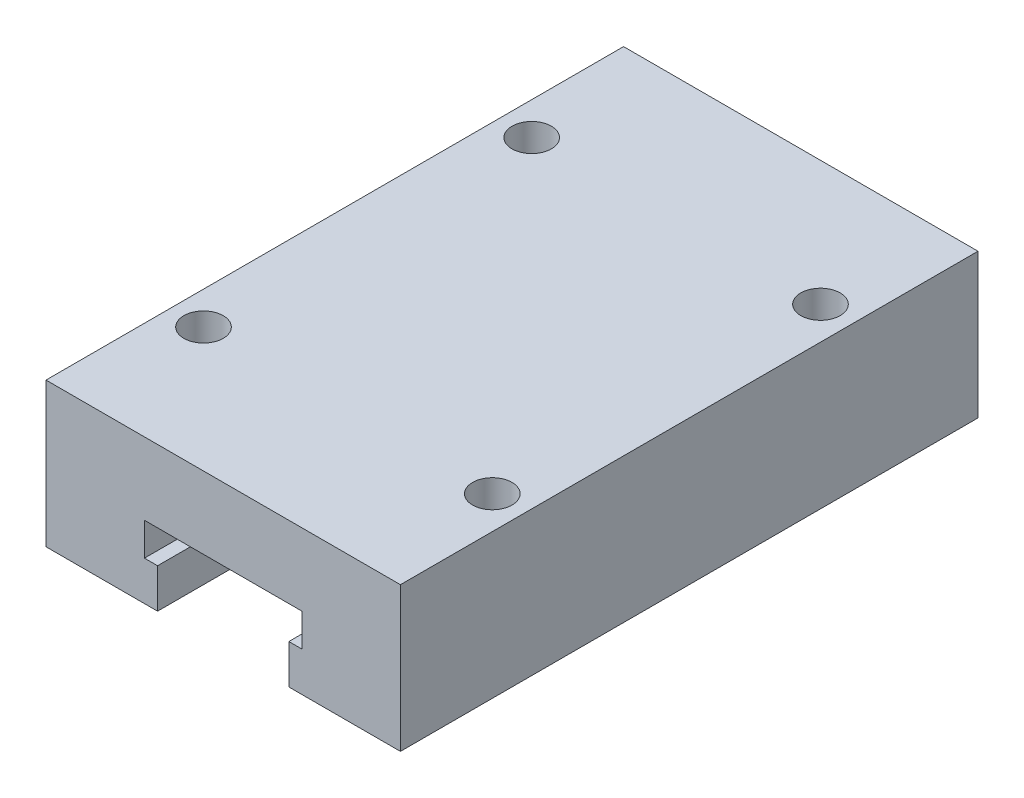
ISO-10303-21;
HEADER;
FILE_DESCRIPTION(('STEP AP214'),'2;1');
FILE_NAME('part.step','',(''),(''),'','','');
FILE_SCHEMA(('AUTOMOTIVE_DESIGN { 1 0 10303 214 1 1 1 1 }'));
ENDSEC;
DATA;
#1=APPLICATION_CONTEXT('core data for automotive mechanical design processes');
#2=APPLICATION_PROTOCOL_DEFINITION('international standard','automotive_design',2000,#1);
#3=PRODUCT_CONTEXT('',#1,'mechanical');
#4=PRODUCT('Part','Part','',(#3));
#5=PRODUCT_RELATED_PRODUCT_CATEGORY('part','',(#4));
#6=PRODUCT_DEFINITION_FORMATION('','',#4);
#7=PRODUCT_DEFINITION_CONTEXT('part definition',#1,'design');
#8=PRODUCT_DEFINITION('design','',#6,#7);
#9=PRODUCT_DEFINITION_SHAPE('','',#8);
#10=(LENGTH_UNIT() NAMED_UNIT(*) SI_UNIT(.MILLI.,.METRE.));
#11=(NAMED_UNIT(*) PLANE_ANGLE_UNIT() SI_UNIT($,.RADIAN.));
#12=(NAMED_UNIT(*) SI_UNIT($,.STERADIAN.) SOLID_ANGLE_UNIT());
#13=UNCERTAINTY_MEASURE_WITH_UNIT(LENGTH_MEASURE(1.E-05),#10,'distance_accuracy_value','');
#14=(GEOMETRIC_REPRESENTATION_CONTEXT(3) GLOBAL_UNCERTAINTY_ASSIGNED_CONTEXT((#13)) GLOBAL_UNIT_ASSIGNED_CONTEXT((#10,
#11,#12)) REPRESENTATION_CONTEXT('',''));
#15=CARTESIAN_POINT('',(0.,0.,0.));
#16=DIRECTION('',(0.,0.,1.));
#17=DIRECTION('',(1.,0.,0.));
#18=AXIS2_PLACEMENT_3D('',#15,#16,#17);
#19=CARTESIAN_POINT('',(7.5,5.5,44.));
#20=DIRECTION('',(0.,1.,0.));
#21=DIRECTION('',(0.,0.,1.));
#22=AXIS2_PLACEMENT_3D('',#19,#20,#21);
#23=PLANE('',#22);
#24=DIRECTION('',(1.,0.,0.));
#25=VECTOR('',#24,1.);
#26=CARTESIAN_POINT('',(7.5,5.5,0.));
#27=LINE('',#26,#25);
#28=CARTESIAN_POINT('',(7.5,5.5,0.));
#29=VERTEX_POINT('',#28);
#30=CARTESIAN_POINT('',(19.5,5.5,0.));
#31=VERTEX_POINT('',#30);
#32=EDGE_CURVE('E164',#29,#31,#27,.T.);
#33=ORIENTED_EDGE('',*,*,#32,.T.);
#34=DIRECTION('',(0.,0.,-1.));
#35=VECTOR('',#34,1.);
#36=CARTESIAN_POINT('',(19.5,5.5,44.));
#37=LINE('',#36,#35);
#38=CARTESIAN_POINT('',(19.5,5.5,44.));
#39=VERTEX_POINT('',#38);
#40=EDGE_CURVE('E11',#39,#31,#37,.T.);
#41=ORIENTED_EDGE('',*,*,#40,.F.);
#42=DIRECTION('',(1.,0.,0.));
#43=VECTOR('',#42,1.);
#44=CARTESIAN_POINT('',(7.5,5.5,44.));
#45=LINE('',#44,#43);
#46=CARTESIAN_POINT('',(7.5,5.5,44.));
#47=VERTEX_POINT('',#46);
#48=EDGE_CURVE('E199',#47,#39,#45,.T.);
#49=ORIENTED_EDGE('',*,*,#48,.F.);
#50=DIRECTION('',(0.,0.,-1.));
#51=VECTOR('',#50,1.);
#52=CARTESIAN_POINT('',(7.5,5.5,44.));
#53=LINE('',#52,#51);
#54=EDGE_CURVE('E160',#47,#29,#53,.T.);
#55=ORIENTED_EDGE('',*,*,#54,.T.);
#56=EDGE_LOOP('',(#33,#41,#49,#55));
#57=FACE_BOUND('',#56,.T.);
#58=ADVANCED_FACE('F39',(#57),#23,.F.);
#59=CARTESIAN_POINT('',(19.5,5.5,44.));
#60=DIRECTION('',(1.,0.,0.));
#61=DIRECTION('',(0.,0.,-1.));
#62=AXIS2_PLACEMENT_3D('',#59,#60,#61);
#63=PLANE('',#62);
#64=DIRECTION('',(0.,-1.,0.));
#65=VECTOR('',#64,1.);
#66=CARTESIAN_POINT('',(19.5,5.5,0.));
#67=LINE('',#66,#65);
#68=CARTESIAN_POINT('',(19.5,3.,0.));
#69=VERTEX_POINT('',#68);
#70=EDGE_CURVE('E168',#31,#69,#67,.T.);
#71=ORIENTED_EDGE('',*,*,#70,.T.);
#72=DIRECTION('',(0.,0.,-1.));
#73=VECTOR('',#72,1.);
#74=CARTESIAN_POINT('',(19.5,3.,44.));
#75=LINE('',#74,#73);
#76=CARTESIAN_POINT('',(19.5,3.,44.));
#77=VERTEX_POINT('',#76);
#78=EDGE_CURVE('E48',#77,#69,#75,.T.);
#79=ORIENTED_EDGE('',*,*,#78,.F.);
#80=DIRECTION('',(0.,-1.,0.));
#81=VECTOR('',#80,1.);
#82=CARTESIAN_POINT('',(19.5,5.5,44.));
#83=LINE('',#82,#81);
#84=EDGE_CURVE('E111',#39,#77,#83,.T.);
#85=ORIENTED_EDGE('',*,*,#84,.F.);
#86=ORIENTED_EDGE('',*,*,#40,.T.);
#87=EDGE_LOOP('',(#71,#79,#85,#86));
#88=FACE_BOUND('',#87,.T.);
#89=ADVANCED_FACE('F293',(#88),#63,.F.);
#90=CARTESIAN_POINT('',(19.5,3.,44.));
#91=DIRECTION('',(0.,-1.,0.));
#92=DIRECTION('',(0.,0.,-1.));
#93=AXIS2_PLACEMENT_3D('',#90,#91,#92);
#94=PLANE('',#93);
#95=DIRECTION('',(-1.,0.,0.));
#96=VECTOR('',#95,1.);
#97=CARTESIAN_POINT('',(19.5,3.,0.));
#98=LINE('',#97,#96);
#99=CARTESIAN_POINT('',(18.5,3.,0.));
#100=VERTEX_POINT('',#99);
#101=EDGE_CURVE('E172',#69,#100,#98,.T.);
#102=ORIENTED_EDGE('',*,*,#101,.T.);
#103=DIRECTION('',(0.,0.,-1.));
#104=VECTOR('',#103,1.);
#105=CARTESIAN_POINT('',(18.5,3.,44.));
#106=LINE('',#105,#104);
#107=CARTESIAN_POINT('',(18.5,3.,44.));
#108=VERTEX_POINT('',#107);
#109=EDGE_CURVE('E226',#108,#100,#106,.T.);
#110=ORIENTED_EDGE('',*,*,#109,.F.);
#111=DIRECTION('',(-1.,0.,0.));
#112=VECTOR('',#111,1.);
#113=CARTESIAN_POINT('',(19.5,3.,44.));
#114=LINE('',#113,#112);
#115=EDGE_CURVE('E236',#77,#108,#114,.T.);
#116=ORIENTED_EDGE('',*,*,#115,.F.);
#117=ORIENTED_EDGE('',*,*,#78,.T.);
#118=EDGE_LOOP('',(#102,#110,#116,#117));
#119=FACE_BOUND('',#118,.T.);
#120=ADVANCED_FACE('F234',(#119),#94,.F.);
#121=CARTESIAN_POINT('',(18.5,3.,44.));
#122=DIRECTION('',(1.,0.,0.));
#123=DIRECTION('',(0.,0.,-1.));
#124=AXIS2_PLACEMENT_3D('',#121,#122,#123);
#125=PLANE('',#124);
#126=DIRECTION('',(0.,-1.,0.));
#127=VECTOR('',#126,1.);
#128=CARTESIAN_POINT('',(18.5,3.,0.));
#129=LINE('',#128,#127);
#130=CARTESIAN_POINT('',(18.5,0.,0.));
#131=VERTEX_POINT('',#130);
#132=EDGE_CURVE('E175',#100,#131,#129,.T.);
#133=ORIENTED_EDGE('',*,*,#132,.T.);
#134=DIRECTION('',(0.,0.,-1.));
#135=VECTOR('',#134,1.);
#136=CARTESIAN_POINT('',(18.5,0.,44.));
#137=LINE('',#136,#135);
#138=CARTESIAN_POINT('',(18.5,0.,44.));
#139=VERTEX_POINT('',#138);
#140=EDGE_CURVE('E222',#139,#131,#137,.T.);
#141=ORIENTED_EDGE('',*,*,#140,.F.);
#142=DIRECTION('',(0.,-1.,0.));
#143=VECTOR('',#142,1.);
#144=CARTESIAN_POINT('',(18.5,3.,44.));
#145=LINE('',#144,#143);
#146=EDGE_CURVE('E255',#108,#139,#145,.T.);
#147=ORIENTED_EDGE('',*,*,#146,.F.);
#148=ORIENTED_EDGE('',*,*,#109,.T.);
#149=EDGE_LOOP('',(#133,#141,#147,#148));
#150=FACE_BOUND('',#149,.T.);
#151=ADVANCED_FACE('F245',(#150),#125,.F.);
#152=CARTESIAN_POINT('',(27.,0.,44.));
#153=DIRECTION('',(0.,1.,0.));
#154=DIRECTION('',(-1.,0.,0.));
#155=AXIS2_PLACEMENT_3D('',#152,#153,#154);
#156=PLANE('',#155);
#157=DIRECTION('',(1.,0.,0.));
#158=VECTOR('',#157,1.);
#159=CARTESIAN_POINT('',(27.,0.,0.));
#160=LINE('',#159,#158);
#161=CARTESIAN_POINT('',(27.,0.,0.));
#162=VERTEX_POINT('',#161);
#163=EDGE_CURVE('E178',#131,#162,#160,.T.);
#164=ORIENTED_EDGE('',*,*,#163,.T.);
#165=DIRECTION('',(0.,0.,-1.));
#166=VECTOR('',#165,1.);
#167=CARTESIAN_POINT('',(27.,0.,44.));
#168=LINE('',#167,#166);
#169=CARTESIAN_POINT('',(27.,0.,44.));
#170=VERTEX_POINT('',#169);
#171=EDGE_CURVE('E218',#170,#162,#168,.T.);
#172=ORIENTED_EDGE('',*,*,#171,.F.);
#173=DIRECTION('',(1.,0.,0.));
#174=VECTOR('',#173,1.);
#175=CARTESIAN_POINT('',(27.,0.,44.));
#176=LINE('',#175,#174);
#177=EDGE_CURVE('E251',#139,#170,#176,.T.);
#178=ORIENTED_EDGE('',*,*,#177,.F.);
#179=ORIENTED_EDGE('',*,*,#140,.T.);
#180=EDGE_LOOP('',(#164,#172,#178,#179));
#181=FACE_BOUND('',#180,.T.);
#182=ADVANCED_FACE('F249',(#181),#156,.F.);
#183=CARTESIAN_POINT('',(27.,11.,44.));
#184=DIRECTION('',(-1.,0.,0.));
#185=DIRECTION('',(0.,0.,1.));
#186=AXIS2_PLACEMENT_3D('',#183,#184,#185);
#187=PLANE('',#186);
#188=DIRECTION('',(0.,1.,0.));
#189=VECTOR('',#188,1.);
#190=CARTESIAN_POINT('',(27.,11.,0.));
#191=LINE('',#190,#189);
#192=CARTESIAN_POINT('',(27.,11.,0.));
#193=VERTEX_POINT('',#192);
#194=EDGE_CURVE('E181',#162,#193,#191,.T.);
#195=ORIENTED_EDGE('',*,*,#194,.T.);
#196=DIRECTION('',(0.,0.,-1.));
#197=VECTOR('',#196,1.);
#198=CARTESIAN_POINT('',(27.,11.,44.));
#199=LINE('',#198,#197);
#200=CARTESIAN_POINT('',(27.,11.,44.));
#201=VERTEX_POINT('',#200);
#202=EDGE_CURVE('E214',#201,#193,#199,.T.);
#203=ORIENTED_EDGE('',*,*,#202,.F.);
#204=DIRECTION('',(0.,1.,0.));
#205=VECTOR('',#204,1.);
#206=CARTESIAN_POINT('',(27.,11.,44.));
#207=LINE('',#206,#205);
#208=EDGE_CURVE('E254',#170,#201,#207,.T.);
#209=ORIENTED_EDGE('',*,*,#208,.F.);
#210=ORIENTED_EDGE('',*,*,#171,.T.);
#211=EDGE_LOOP('',(#195,#203,#209,#210));
#212=FACE_BOUND('',#211,.T.);
#213=ADVANCED_FACE('F306',(#212),#187,.F.);
#214=CARTESIAN_POINT('',(0.,11.,44.));
#215=DIRECTION('',(0.,-1.,0.));
#216=DIRECTION('',(1.,0.,0.));
#217=AXIS2_PLACEMENT_3D('',#214,#215,#216);
#218=PLANE('',#217);
#219=CARTESIAN_POINT('',(2.5,11.,34.5));
#220=DIRECTION('',(0.,1.,0.));
#221=DIRECTION('',(-1.,0.,0.));
#222=AXIS2_PLACEMENT_3D('',#219,#220,#221);
#223=CIRCLE('',#222,1.5);
#224=CARTESIAN_POINT('',(1.,11.,34.5));
#225=VERTEX_POINT('',#224);
#226=EDGE_CURVE('E441',#225,#225,#223,.T.);
#227=ORIENTED_EDGE('',*,*,#226,.F.);
#228=EDGE_LOOP('',(#227));
#229=FACE_BOUND('',#228,.T.);
#230=CARTESIAN_POINT('',(24.5,11.,34.5));
#231=DIRECTION('',(0.,1.,0.));
#232=DIRECTION('',(-1.,0.,0.));
#233=AXIS2_PLACEMENT_3D('',#230,#231,#232);
#234=CIRCLE('',#233,1.5);
#235=CARTESIAN_POINT('',(23.,11.,34.5));
#236=VERTEX_POINT('',#235);
#237=EDGE_CURVE('E440',#236,#236,#234,.T.);
#238=ORIENTED_EDGE('',*,*,#237,.F.);
#239=EDGE_LOOP('',(#238));
#240=FACE_BOUND('',#239,.T.);
#241=CARTESIAN_POINT('',(24.5,11.,9.5));
#242=DIRECTION('',(0.,1.,0.));
#243=DIRECTION('',(-1.,0.,0.));
#244=AXIS2_PLACEMENT_3D('',#241,#242,#243);
#245=CIRCLE('',#244,1.5);
#246=CARTESIAN_POINT('',(23.,11.,9.5));
#247=VERTEX_POINT('',#246);
#248=EDGE_CURVE('E467',#247,#247,#245,.T.);
#249=ORIENTED_EDGE('',*,*,#248,.F.);
#250=EDGE_LOOP('',(#249));
#251=FACE_BOUND('',#250,.T.);
#252=CARTESIAN_POINT('',(2.5,11.,9.49999999999999));
#253=DIRECTION('',(0.,1.,0.));
#254=DIRECTION('',(-1.,0.,0.));
#255=AXIS2_PLACEMENT_3D('',#252,#253,#254);
#256=CIRCLE('',#255,1.5);
#257=CARTESIAN_POINT('',(1.,11.,9.49999999999999));
#258=VERTEX_POINT('',#257);
#259=EDGE_CURVE('E455',#258,#258,#256,.T.);
#260=ORIENTED_EDGE('',*,*,#259,.F.);
#261=EDGE_LOOP('',(#260));
#262=FACE_BOUND('',#261,.T.);
#263=DIRECTION('',(-1.,0.,0.));
#264=VECTOR('',#263,1.);
#265=CARTESIAN_POINT('',(0.,11.,0.));
#266=LINE('',#265,#264);
#267=CARTESIAN_POINT('',(0.,11.,0.));
#268=VERTEX_POINT('',#267);
#269=EDGE_CURVE('E184',#193,#268,#266,.T.);
#270=ORIENTED_EDGE('',*,*,#269,.T.);
#271=DIRECTION('',(0.,0.,-1.));
#272=VECTOR('',#271,1.);
#273=CARTESIAN_POINT('',(0.,11.,44.));
#274=LINE('',#273,#272);
#275=CARTESIAN_POINT('',(0.,11.,44.));
#276=VERTEX_POINT('',#275);
#277=EDGE_CURVE('E210',#276,#268,#274,.T.);
#278=ORIENTED_EDGE('',*,*,#277,.F.);
#279=DIRECTION('',(-1.,0.,0.));
#280=VECTOR('',#279,1.);
#281=CARTESIAN_POINT('',(0.,11.,44.));
#282=LINE('',#281,#280);
#283=EDGE_CURVE('E259',#201,#276,#282,.T.);
#284=ORIENTED_EDGE('',*,*,#283,.F.);
#285=ORIENTED_EDGE('',*,*,#202,.T.);
#286=EDGE_LOOP('',(#270,#278,#284,#285));
#287=FACE_BOUND('',#286,.T.);
#288=ADVANCED_FACE('F309',(#229,#240,#251,#262,#287),#218,.F.);
#289=CARTESIAN_POINT('',(0.,0.,44.));
#290=DIRECTION('',(1.,0.,0.));
#291=DIRECTION('',(0.,1.,0.));
#292=AXIS2_PLACEMENT_3D('',#289,#290,#291);
#293=PLANE('',#292);
#294=DIRECTION('',(0.,-1.,0.));
#295=VECTOR('',#294,1.);
#296=CARTESIAN_POINT('',(0.,0.,0.));
#297=LINE('',#296,#295);
#298=CARTESIAN_POINT('',(0.,0.,0.));
#299=VERTEX_POINT('',#298);
#300=EDGE_CURVE('E187',#268,#299,#297,.T.);
#301=ORIENTED_EDGE('',*,*,#300,.T.);
#302=DIRECTION('',(0.,0.,-1.));
#303=VECTOR('',#302,1.);
#304=CARTESIAN_POINT('',(0.,0.,44.));
#305=LINE('',#304,#303);
#306=CARTESIAN_POINT('',(0.,0.,44.));
#307=VERTEX_POINT('',#306);
#308=EDGE_CURVE('E206',#307,#299,#305,.T.);
#309=ORIENTED_EDGE('',*,*,#308,.F.);
#310=DIRECTION('',(0.,-1.,0.));
#311=VECTOR('',#310,1.);
#312=CARTESIAN_POINT('',(0.,0.,44.));
#313=LINE('',#312,#311);
#314=EDGE_CURVE('E266',#276,#307,#313,.T.);
#315=ORIENTED_EDGE('',*,*,#314,.F.);
#316=ORIENTED_EDGE('',*,*,#277,.T.);
#317=EDGE_LOOP('',(#301,#309,#315,#316));
#318=FACE_BOUND('',#317,.T.);
#319=ADVANCED_FACE('F274',(#318),#293,.F.);
#320=CARTESIAN_POINT('',(0.,0.,44.));
#321=DIRECTION('',(0.,1.,0.));
#322=DIRECTION('',(0.,0.,1.));
#323=AXIS2_PLACEMENT_3D('',#320,#321,#322);
#324=PLANE('',#323);
#325=DIRECTION('',(1.,0.,0.));
#326=VECTOR('',#325,1.);
#327=CARTESIAN_POINT('',(0.,0.,0.));
#328=LINE('',#327,#326);
#329=CARTESIAN_POINT('',(8.5,0.,0.));
#330=VERTEX_POINT('',#329);
#331=EDGE_CURVE('E190',#299,#330,#328,.T.);
#332=ORIENTED_EDGE('',*,*,#331,.T.);
#333=DIRECTION('',(0.,0.,-1.));
#334=VECTOR('',#333,1.);
#335=CARTESIAN_POINT('',(8.5,0.,44.));
#336=LINE('',#335,#334);
#337=CARTESIAN_POINT('',(8.5,0.,44.));
#338=VERTEX_POINT('',#337);
#339=EDGE_CURVE('E153',#338,#330,#336,.T.);
#340=ORIENTED_EDGE('',*,*,#339,.F.);
#341=DIRECTION('',(1.,0.,0.));
#342=VECTOR('',#341,1.);
#343=CARTESIAN_POINT('',(0.,0.,44.));
#344=LINE('',#343,#342);
#345=EDGE_CURVE('E142',#307,#338,#344,.T.);
#346=ORIENTED_EDGE('',*,*,#345,.F.);
#347=ORIENTED_EDGE('',*,*,#308,.T.);
#348=EDGE_LOOP('',(#332,#340,#346,#347));
#349=FACE_BOUND('',#348,.T.);
#350=ADVANCED_FACE('F278',(#349),#324,.F.);
#351=CARTESIAN_POINT('',(8.5,3.,44.));
#352=DIRECTION('',(-1.,0.,0.));
#353=DIRECTION('',(0.,0.,1.));
#354=AXIS2_PLACEMENT_3D('',#351,#352,#353);
#355=PLANE('',#354);
#356=DIRECTION('',(0.,1.,0.));
#357=VECTOR('',#356,1.);
#358=CARTESIAN_POINT('',(8.5,3.,0.));
#359=LINE('',#358,#357);
#360=CARTESIAN_POINT('',(8.5,3.,0.));
#361=VERTEX_POINT('',#360);
#362=EDGE_CURVE('E151',#330,#361,#359,.T.);
#363=ORIENTED_EDGE('',*,*,#362,.T.);
#364=DIRECTION('',(0.,0.,-1.));
#365=VECTOR('',#364,1.);
#366=CARTESIAN_POINT('',(8.5,3.,44.));
#367=LINE('',#366,#365);
#368=CARTESIAN_POINT('',(8.5,3.,44.));
#369=VERTEX_POINT('',#368);
#370=EDGE_CURVE('E148',#369,#361,#367,.T.);
#371=ORIENTED_EDGE('',*,*,#370,.F.);
#372=DIRECTION('',(0.,1.,0.));
#373=VECTOR('',#372,1.);
#374=CARTESIAN_POINT('',(8.5,3.,44.));
#375=LINE('',#374,#373);
#376=EDGE_CURVE('E136',#338,#369,#375,.T.);
#377=ORIENTED_EDGE('',*,*,#376,.F.);
#378=ORIENTED_EDGE('',*,*,#339,.T.);
#379=EDGE_LOOP('',(#363,#371,#377,#378));
#380=FACE_BOUND('',#379,.T.);
#381=ADVANCED_FACE('F149',(#380),#355,.F.);
#382=CARTESIAN_POINT('',(7.5,3.,44.));
#383=DIRECTION('',(0.,-1.,0.));
#384=DIRECTION('',(0.,0.,-1.));
#385=AXIS2_PLACEMENT_3D('',#382,#383,#384);
#386=PLANE('',#385);
#387=DIRECTION('',(-1.,0.,0.));
#388=VECTOR('',#387,1.);
#389=CARTESIAN_POINT('',(7.5,3.,0.));
#390=LINE('',#389,#388);
#391=CARTESIAN_POINT('',(7.5,3.,0.));
#392=VERTEX_POINT('',#391);
#393=EDGE_CURVE('E97',#361,#392,#390,.T.);
#394=ORIENTED_EDGE('',*,*,#393,.T.);
#395=DIRECTION('',(0.,0.,-1.));
#396=VECTOR('',#395,1.);
#397=CARTESIAN_POINT('',(7.5,3.,44.));
#398=LINE('',#397,#396);
#399=CARTESIAN_POINT('',(7.5,3.,44.));
#400=VERTEX_POINT('',#399);
#401=EDGE_CURVE('E154',#400,#392,#398,.T.);
#402=ORIENTED_EDGE('',*,*,#401,.F.);
#403=DIRECTION('',(-1.,0.,0.));
#404=VECTOR('',#403,1.);
#405=CARTESIAN_POINT('',(7.5,3.,44.));
#406=LINE('',#405,#404);
#407=EDGE_CURVE('E140',#369,#400,#406,.T.);
#408=ORIENTED_EDGE('',*,*,#407,.F.);
#409=ORIENTED_EDGE('',*,*,#370,.T.);
#410=EDGE_LOOP('',(#394,#402,#408,#409));
#411=FACE_BOUND('',#410,.T.);
#412=ADVANCED_FACE('F156',(#411),#386,.F.);
#413=CARTESIAN_POINT('',(7.5,5.5,44.));
#414=DIRECTION('',(-1.,0.,0.));
#415=DIRECTION('',(0.,0.,1.));
#416=AXIS2_PLACEMENT_3D('',#413,#414,#415);
#417=PLANE('',#416);
#418=DIRECTION('',(0.,1.,0.));
#419=VECTOR('',#418,1.);
#420=CARTESIAN_POINT('',(7.5,5.5,0.));
#421=LINE('',#420,#419);
#422=EDGE_CURVE('E103',#392,#29,#421,.T.);
#423=ORIENTED_EDGE('',*,*,#422,.T.);
#424=ORIENTED_EDGE('',*,*,#54,.F.);
#425=DIRECTION('',(0.,1.,0.));
#426=VECTOR('',#425,1.);
#427=CARTESIAN_POINT('',(7.5,5.5,44.));
#428=LINE('',#427,#426);
#429=EDGE_CURVE('E56',#400,#47,#428,.T.);
#430=ORIENTED_EDGE('',*,*,#429,.F.);
#431=ORIENTED_EDGE('',*,*,#401,.T.);
#432=EDGE_LOOP('',(#423,#424,#430,#431));
#433=FACE_BOUND('',#432,.T.);
#434=ADVANCED_FACE('F282',(#433),#417,.F.);
#435=CARTESIAN_POINT('',(0.,0.,44.));
#436=DIRECTION('',(0.,0.,-1.));
#437=DIRECTION('',(-1.,0.,0.));
#438=AXIS2_PLACEMENT_3D('',#435,#436,#437);
#439=PLANE('',#438);
#440=ORIENTED_EDGE('',*,*,#48,.T.);
#441=ORIENTED_EDGE('',*,*,#84,.T.);
#442=ORIENTED_EDGE('',*,*,#115,.T.);
#443=ORIENTED_EDGE('',*,*,#146,.T.);
#444=ORIENTED_EDGE('',*,*,#177,.T.);
#445=ORIENTED_EDGE('',*,*,#208,.T.);
#446=ORIENTED_EDGE('',*,*,#283,.T.);
#447=ORIENTED_EDGE('',*,*,#314,.T.);
#448=ORIENTED_EDGE('',*,*,#345,.T.);
#449=ORIENTED_EDGE('',*,*,#376,.T.);
#450=ORIENTED_EDGE('',*,*,#407,.T.);
#451=ORIENTED_EDGE('',*,*,#429,.T.);
#452=EDGE_LOOP('',(#440,#441,#442,#443,#444,#445,#446,#447,#448,#449,#450,#451));
#453=FACE_BOUND('',#452,.T.);
#454=ADVANCED_FACE('F138',(#453),#439,.F.);
#455=CARTESIAN_POINT('',(0.,0.,0.));
#456=DIRECTION('',(0.,0.,-1.));
#457=DIRECTION('',(-1.,0.,0.));
#458=AXIS2_PLACEMENT_3D('',#455,#456,#457);
#459=PLANE('',#458);
#460=ORIENTED_EDGE('',*,*,#32,.F.);
#461=ORIENTED_EDGE('',*,*,#422,.F.);
#462=ORIENTED_EDGE('',*,*,#393,.F.);
#463=ORIENTED_EDGE('',*,*,#362,.F.);
#464=ORIENTED_EDGE('',*,*,#331,.F.);
#465=ORIENTED_EDGE('',*,*,#300,.F.);
#466=ORIENTED_EDGE('',*,*,#269,.F.);
#467=ORIENTED_EDGE('',*,*,#194,.F.);
#468=ORIENTED_EDGE('',*,*,#163,.F.);
#469=ORIENTED_EDGE('',*,*,#132,.F.);
#470=ORIENTED_EDGE('',*,*,#101,.F.);
#471=ORIENTED_EDGE('',*,*,#70,.F.);
#472=EDGE_LOOP('',(#460,#461,#462,#463,#464,#465,#466,#467,#468,#469,#470,#471));
#473=FACE_BOUND('',#472,.T.);
#474=ADVANCED_FACE('F240',(#473),#459,.T.);
#475=CARTESIAN_POINT('',(2.5,7.,9.49999999999999));
#476=DIRECTION('',(0.,1.,0.));
#477=DIRECTION('',(-1.,0.,0.));
#478=AXIS2_PLACEMENT_3D('',#475,#476,#477);
#479=CYLINDRICAL_SURFACE('',#478,1.5);
#480=CARTESIAN_POINT('',(2.5,7.,9.49999999999999));
#481=DIRECTION('',(0.,1.,0.));
#482=DIRECTION('',(-1.,0.,0.));
#483=AXIS2_PLACEMENT_3D('',#480,#481,#482);
#484=CIRCLE('',#483,1.5);
#485=CARTESIAN_POINT('',(1.,7.,9.49999999999999));
#486=VERTEX_POINT('',#485);
#487=EDGE_CURVE('E169',#486,#486,#484,.T.);
#488=ORIENTED_EDGE('',*,*,#487,.F.);
#489=EDGE_LOOP('',(#488));
#490=FACE_BOUND('',#489,.T.);
#491=ORIENTED_EDGE('',*,*,#259,.T.);
#492=EDGE_LOOP('',(#491));
#493=FACE_BOUND('',#492,.T.);
#494=ADVANCED_FACE('F346',(#490,#493),#479,.F.);
#495=CARTESIAN_POINT('',(2.5,7.,9.49999999999999));
#496=DIRECTION('',(0.,1.,0.));
#497=DIRECTION('',(-1.,0.,0.));
#498=AXIS2_PLACEMENT_3D('',#495,#496,#497);
#499=PLANE('',#498);
#500=ORIENTED_EDGE('',*,*,#487,.T.);
#501=EDGE_LOOP('',(#500));
#502=FACE_BOUND('',#501,.T.);
#503=ADVANCED_FACE('F362',(#502),#499,.T.);
#504=CARTESIAN_POINT('',(24.5,7.,9.5));
#505=DIRECTION('',(0.,1.,0.));
#506=DIRECTION('',(-1.,0.,0.));
#507=AXIS2_PLACEMENT_3D('',#504,#505,#506);
#508=CYLINDRICAL_SURFACE('',#507,1.5);
#509=CARTESIAN_POINT('',(24.5,7.,9.5));
#510=DIRECTION('',(0.,1.,0.));
#511=DIRECTION('',(-1.,0.,0.));
#512=AXIS2_PLACEMENT_3D('',#509,#510,#511);
#513=CIRCLE('',#512,1.5);
#514=CARTESIAN_POINT('',(23.,7.,9.5));
#515=VERTEX_POINT('',#514);
#516=EDGE_CURVE('E459',#515,#515,#513,.T.);
#517=ORIENTED_EDGE('',*,*,#516,.F.);
#518=EDGE_LOOP('',(#517));
#519=FACE_BOUND('',#518,.T.);
#520=ORIENTED_EDGE('',*,*,#248,.T.);
#521=EDGE_LOOP('',(#520));
#522=FACE_BOUND('',#521,.T.);
#523=ADVANCED_FACE('F372',(#519,#522),#508,.F.);
#524=CARTESIAN_POINT('',(24.5,7.,9.5));
#525=DIRECTION('',(0.,1.,0.));
#526=DIRECTION('',(-1.,0.,0.));
#527=AXIS2_PLACEMENT_3D('',#524,#525,#526);
#528=PLANE('',#527);
#529=ORIENTED_EDGE('',*,*,#516,.T.);
#530=EDGE_LOOP('',(#529));
#531=FACE_BOUND('',#530,.T.);
#532=ADVANCED_FACE('F382',(#531),#528,.T.);
#533=CARTESIAN_POINT('',(24.5,7.,34.5));
#534=DIRECTION('',(0.,1.,0.));
#535=DIRECTION('',(-1.,0.,0.));
#536=AXIS2_PLACEMENT_3D('',#533,#534,#535);
#537=CYLINDRICAL_SURFACE('',#536,1.5);
#538=CARTESIAN_POINT('',(24.5,7.,34.5));
#539=DIRECTION('',(0.,1.,0.));
#540=DIRECTION('',(-1.,0.,0.));
#541=AXIS2_PLACEMENT_3D('',#538,#539,#540);
#542=CIRCLE('',#541,1.5);
#543=CARTESIAN_POINT('',(23.,7.,34.5));
#544=VERTEX_POINT('',#543);
#545=EDGE_CURVE('E446',#544,#544,#542,.T.);
#546=ORIENTED_EDGE('',*,*,#545,.F.);
#547=EDGE_LOOP('',(#546));
#548=FACE_BOUND('',#547,.T.);
#549=ORIENTED_EDGE('',*,*,#237,.T.);
#550=EDGE_LOOP('',(#549));
#551=FACE_BOUND('',#550,.T.);
#552=ADVANCED_FACE('F392',(#548,#551),#537,.F.);
#553=CARTESIAN_POINT('',(24.5,7.,34.5));
#554=DIRECTION('',(0.,1.,0.));
#555=DIRECTION('',(-1.,0.,0.));
#556=AXIS2_PLACEMENT_3D('',#553,#554,#555);
#557=PLANE('',#556);
#558=ORIENTED_EDGE('',*,*,#545,.T.);
#559=EDGE_LOOP('',(#558));
#560=FACE_BOUND('',#559,.T.);
#561=ADVANCED_FACE('F402',(#560),#557,.T.);
#562=CARTESIAN_POINT('',(2.5,7.,34.5));
#563=DIRECTION('',(0.,1.,0.));
#564=DIRECTION('',(-1.,0.,0.));
#565=AXIS2_PLACEMENT_3D('',#562,#563,#564);
#566=CYLINDRICAL_SURFACE('',#565,1.5);
#567=CARTESIAN_POINT('',(2.5,7.,34.5));
#568=DIRECTION('',(0.,1.,0.));
#569=DIRECTION('',(-1.,0.,0.));
#570=AXIS2_PLACEMENT_3D('',#567,#568,#569);
#571=CIRCLE('',#570,1.5);
#572=CARTESIAN_POINT('',(1.,7.,34.5));
#573=VERTEX_POINT('',#572);
#574=EDGE_CURVE('E438',#573,#573,#571,.T.);
#575=ORIENTED_EDGE('',*,*,#574,.F.);
#576=EDGE_LOOP('',(#575));
#577=FACE_BOUND('',#576,.T.);
#578=ORIENTED_EDGE('',*,*,#226,.T.);
#579=EDGE_LOOP('',(#578));
#580=FACE_BOUND('',#579,.T.);
#581=ADVANCED_FACE('F412',(#577,#580),#566,.F.);
#582=CARTESIAN_POINT('',(2.5,7.,34.5));
#583=DIRECTION('',(0.,1.,0.));
#584=DIRECTION('',(-1.,0.,0.));
#585=AXIS2_PLACEMENT_3D('',#582,#583,#584);
#586=PLANE('',#585);
#587=ORIENTED_EDGE('',*,*,#574,.T.);
#588=EDGE_LOOP('',(#587));
#589=FACE_BOUND('',#588,.T.);
#590=ADVANCED_FACE('F422',(#589),#586,.T.);
#591=CLOSED_SHELL('',(#58,#89,#120,#151,#182,#213,#288,#319,#350,#381,#412,#434,#454,#474,#494,
#503,#523,#532,#552,#561,#581,#590));
#592=MANIFOLD_SOLID_BREP('B2',#591);
#593=ADVANCED_BREP_SHAPE_REPRESENTATION('',(#18,#592),#14);
#594=SHAPE_DEFINITION_REPRESENTATION(#9,#593);
ENDSEC;
END-ISO-10303-21;
